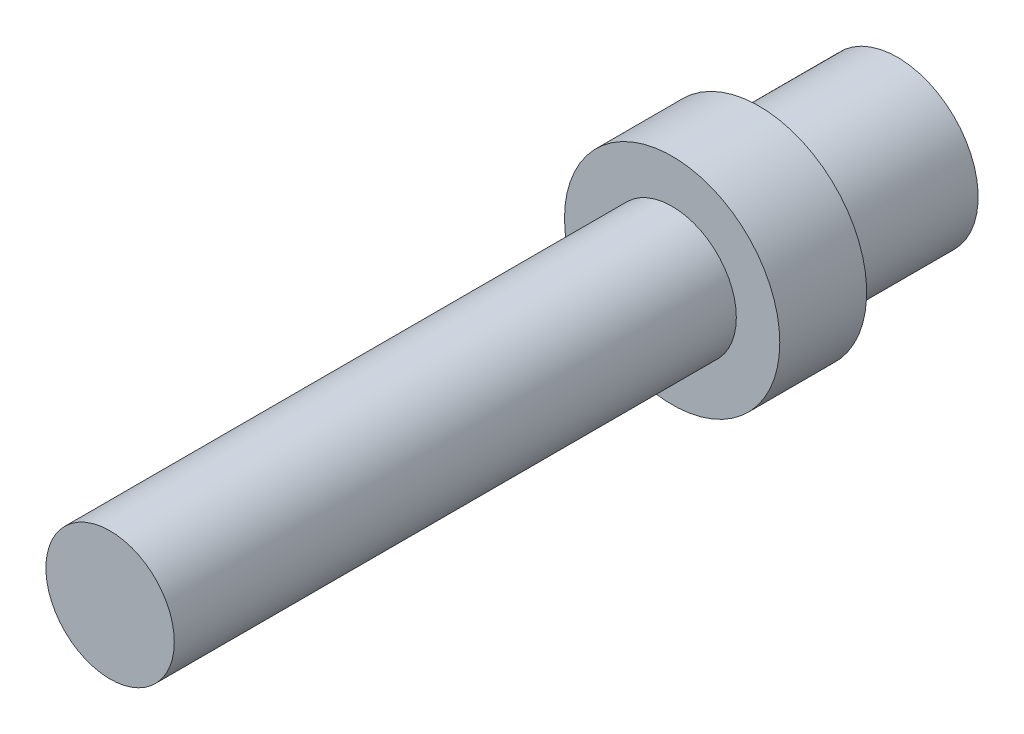
ISO-10303-21;
HEADER;
FILE_DESCRIPTION(('STEP AP214'),'2;1');
FILE_NAME('part.step','',(''),(''),'','','');
FILE_SCHEMA(('AUTOMOTIVE_DESIGN { 1 0 10303 214 1 1 1 1 }'));
ENDSEC;
DATA;
#1=APPLICATION_CONTEXT('core data for automotive mechanical design processes');
#2=APPLICATION_PROTOCOL_DEFINITION('international standard','automotive_design',2000,#1);
#3=PRODUCT_CONTEXT('',#1,'mechanical');
#4=PRODUCT('Part','Part','',(#3));
#5=PRODUCT_RELATED_PRODUCT_CATEGORY('part','',(#4));
#6=PRODUCT_DEFINITION_FORMATION('','',#4);
#7=PRODUCT_DEFINITION_CONTEXT('part definition',#1,'design');
#8=PRODUCT_DEFINITION('design','',#6,#7);
#9=PRODUCT_DEFINITION_SHAPE('','',#8);
#10=(LENGTH_UNIT() NAMED_UNIT(*) SI_UNIT(.MILLI.,.METRE.));
#11=(NAMED_UNIT(*) PLANE_ANGLE_UNIT() SI_UNIT($,.RADIAN.));
#12=(NAMED_UNIT(*) SI_UNIT($,.STERADIAN.) SOLID_ANGLE_UNIT());
#13=UNCERTAINTY_MEASURE_WITH_UNIT(LENGTH_MEASURE(1.E-05),#10,'distance_accuracy_value','');
#14=(GEOMETRIC_REPRESENTATION_CONTEXT(3) GLOBAL_UNCERTAINTY_ASSIGNED_CONTEXT((#13)) GLOBAL_UNIT_ASSIGNED_CONTEXT((#10,
#11,#12)) REPRESENTATION_CONTEXT('',''));
#15=CARTESIAN_POINT('',(0.,0.,0.));
#16=DIRECTION('',(0.,0.,1.));
#17=DIRECTION('',(1.,0.,0.));
#18=AXIS2_PLACEMENT_3D('',#15,#16,#17);
#19=CARTESIAN_POINT('',(0.,0.,85.));
#20=DIRECTION('',(0.,0.,-1.));
#21=DIRECTION('',(-1.,0.,0.));
#22=AXIS2_PLACEMENT_3D('',#19,#20,#21);
#23=CYLINDRICAL_SURFACE('',#22,14.);
#24=CARTESIAN_POINT('',(0.,0.,18.));
#25=DIRECTION('',(0.,0.,-1.));
#26=DIRECTION('',(-1.,0.,0.));
#27=AXIS2_PLACEMENT_3D('',#24,#25,#26);
#28=CIRCLE('',#27,14.);
#29=CARTESIAN_POINT('',(-14.,0.,18.));
#30=VERTEX_POINT('',#29);
#31=EDGE_CURVE('E48',#30,#30,#28,.T.);
#32=ORIENTED_EDGE('',*,*,#31,.F.);
#33=EDGE_LOOP('',(#32));
#34=FACE_BOUND('',#33,.T.);
#35=CARTESIAN_POINT('',(0.,0.,29.3));
#36=DIRECTION('',(0.,0.,1.));
#37=DIRECTION('',(1.,0.,0.));
#38=AXIS2_PLACEMENT_3D('',#35,#36,#37);
#39=CIRCLE('',#38,14.);
#40=CARTESIAN_POINT('',(14.,0.,29.3));
#41=VERTEX_POINT('',#40);
#42=EDGE_CURVE('E59',#41,#41,#39,.T.);
#43=ORIENTED_EDGE('',*,*,#42,.F.);
#44=EDGE_LOOP('',(#43));
#45=FACE_BOUND('',#44,.T.);
#46=ADVANCED_FACE('F44',(#34,#45),#23,.T.);
#47=CARTESIAN_POINT('',(0.,0.,18.));
#48=DIRECTION('',(0.,0.,-1.));
#49=DIRECTION('',(-1.,0.,0.));
#50=AXIS2_PLACEMENT_3D('',#47,#48,#49);
#51=PLANE('',#50);
#52=ORIENTED_EDGE('',*,*,#31,.T.);
#53=EDGE_LOOP('',(#52));
#54=FACE_BOUND('',#53,.T.);
#55=CARTESIAN_POINT('',(0.,0.,18.));
#56=DIRECTION('',(0.,0.,-1.));
#57=DIRECTION('',(-1.,0.,0.));
#58=AXIS2_PLACEMENT_3D('',#55,#56,#57);
#59=CIRCLE('',#58,10.5);
#60=CARTESIAN_POINT('',(-10.5,0.,18.));
#61=VERTEX_POINT('',#60);
#62=EDGE_CURVE('E68',#61,#61,#59,.T.);
#63=ORIENTED_EDGE('',*,*,#62,.F.);
#64=EDGE_LOOP('',(#63));
#65=FACE_BOUND('',#64,.T.);
#66=ADVANCED_FACE('F92',(#54,#65),#51,.T.);
#67=CARTESIAN_POINT('',(0.,0.,29.3));
#68=DIRECTION('',(0.,0.,1.));
#69=DIRECTION('',(1.,0.,0.));
#70=AXIS2_PLACEMENT_3D('',#67,#68,#69);
#71=PLANE('',#70);
#72=CARTESIAN_POINT('',(0.,0.,29.3));
#73=DIRECTION('',(0.,0.,1.));
#74=DIRECTION('',(1.,0.,0.));
#75=AXIS2_PLACEMENT_3D('',#72,#73,#74);
#76=CIRCLE('',#75,8.35);
#77=CARTESIAN_POINT('',(8.35,0.,29.3));
#78=VERTEX_POINT('',#77);
#79=EDGE_CURVE('E11',#78,#78,#76,.T.);
#80=ORIENTED_EDGE('',*,*,#79,.F.);
#81=EDGE_LOOP('',(#80));
#82=FACE_BOUND('',#81,.T.);
#83=ORIENTED_EDGE('',*,*,#42,.T.);
#84=EDGE_LOOP('',(#83));
#85=FACE_BOUND('',#84,.T.);
#86=ADVANCED_FACE('F99',(#82,#85),#71,.T.);
#87=CARTESIAN_POINT('',(0.,0.,102.4));
#88=DIRECTION('',(0.,0.,-1.));
#89=DIRECTION('',(-1.,0.,0.));
#90=AXIS2_PLACEMENT_3D('',#87,#88,#89);
#91=CYLINDRICAL_SURFACE('',#90,8.35);
#92=CARTESIAN_POINT('',(0.,0.,102.4));
#93=DIRECTION('',(0.,0.,1.));
#94=DIRECTION('',(1.,0.,0.));
#95=AXIS2_PLACEMENT_3D('',#92,#93,#94);
#96=CIRCLE('',#95,8.35);
#97=CARTESIAN_POINT('',(8.35,0.,102.4));
#98=VERTEX_POINT('',#97);
#99=EDGE_CURVE('E58',#98,#98,#96,.T.);
#100=ORIENTED_EDGE('',*,*,#99,.F.);
#101=EDGE_LOOP('',(#100));
#102=FACE_BOUND('',#101,.T.);
#103=ORIENTED_EDGE('',*,*,#79,.T.);
#104=EDGE_LOOP('',(#103));
#105=FACE_BOUND('',#104,.T.);
#106=ADVANCED_FACE('F95',(#102,#105),#91,.T.);
#107=CARTESIAN_POINT('',(0.,0.,102.4));
#108=DIRECTION('',(0.,0.,1.));
#109=DIRECTION('',(1.,0.,0.));
#110=AXIS2_PLACEMENT_3D('',#107,#108,#109);
#111=PLANE('',#110);
#112=ORIENTED_EDGE('',*,*,#99,.T.);
#113=EDGE_LOOP('',(#112));
#114=FACE_BOUND('',#113,.T.);
#115=ADVANCED_FACE('F84',(#114),#111,.T.);
#116=CARTESIAN_POINT('',(0.,0.,18.));
#117=DIRECTION('',(0.,0.,-1.));
#118=DIRECTION('',(-1.,0.,0.));
#119=AXIS2_PLACEMENT_3D('',#116,#117,#118);
#120=CYLINDRICAL_SURFACE('',#119,10.5);
#121=ORIENTED_EDGE('',*,*,#62,.T.);
#122=EDGE_LOOP('',(#121));
#123=FACE_BOUND('',#122,.T.);
#124=CARTESIAN_POINT('',(0.,0.,0.));
#125=DIRECTION('',(0.,0.,-1.));
#126=DIRECTION('',(-1.,0.,0.));
#127=AXIS2_PLACEMENT_3D('',#124,#125,#126);
#128=CIRCLE('',#127,10.5);
#129=CARTESIAN_POINT('',(-10.5,0.,0.));
#130=VERTEX_POINT('',#129);
#131=EDGE_CURVE('E71',#130,#130,#128,.T.);
#132=ORIENTED_EDGE('',*,*,#131,.F.);
#133=EDGE_LOOP('',(#132));
#134=FACE_BOUND('',#133,.T.);
#135=ADVANCED_FACE('F83',(#123,#134),#120,.T.);
#136=CARTESIAN_POINT('',(0.,0.,0.));
#137=DIRECTION('',(0.,0.,1.));
#138=DIRECTION('',(1.,0.,0.));
#139=AXIS2_PLACEMENT_3D('',#136,#137,#138);
#140=PLANE('',#139);
#141=ORIENTED_EDGE('',*,*,#131,.T.);
#142=EDGE_LOOP('',(#141));
#143=FACE_BOUND('',#142,.T.);
#144=ADVANCED_FACE('F81',(#143),#140,.F.);
#145=CLOSED_SHELL('',(#46,#66,#86,#106,#115,#135,#144));
#146=MANIFOLD_SOLID_BREP('B2',#145);
#147=ADVANCED_BREP_SHAPE_REPRESENTATION('',(#18,#146),#14);
#148=SHAPE_DEFINITION_REPRESENTATION(#9,#147);
ENDSEC;
END-ISO-10303-21;
